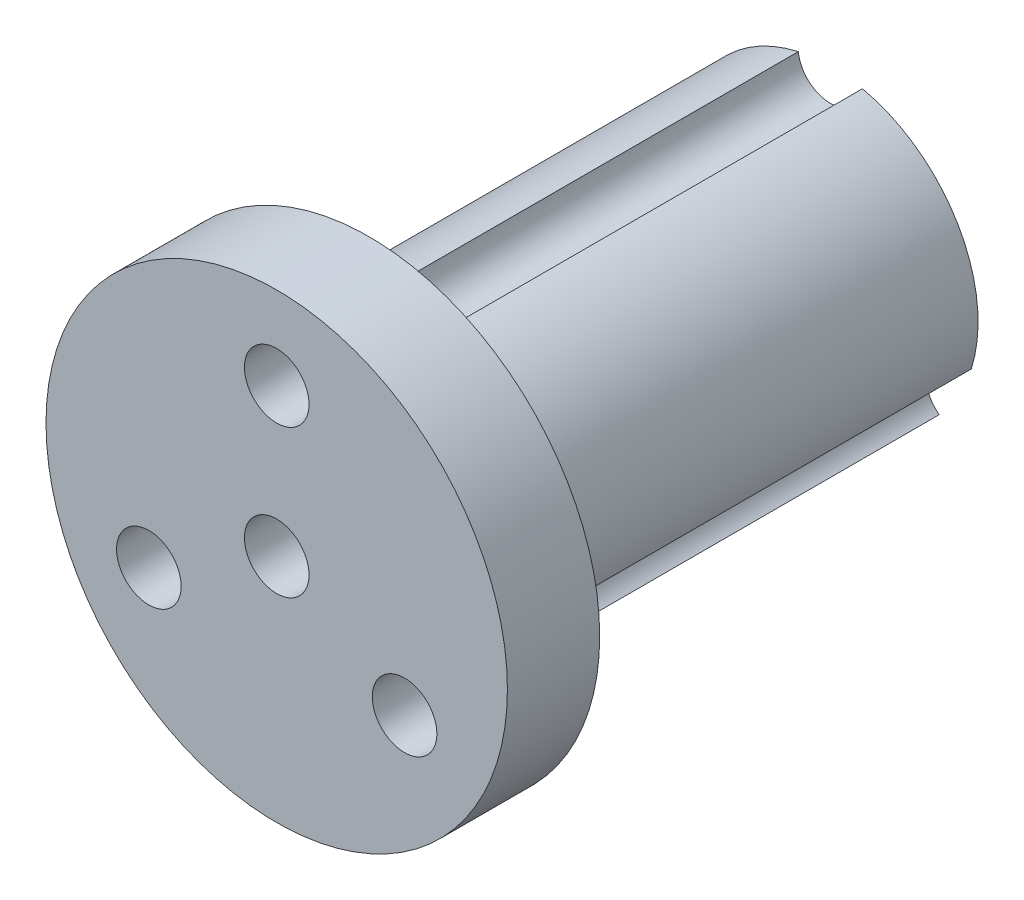
ISO-10303-21;
HEADER;
FILE_DESCRIPTION(('STEP AP214'),'2;1');
FILE_NAME('part.step','',(''),(''),'','','');
FILE_SCHEMA(('AUTOMOTIVE_DESIGN { 1 0 10303 214 1 1 1 1 }'));
ENDSEC;
DATA;
#1=APPLICATION_CONTEXT('core data for automotive mechanical design processes');
#2=APPLICATION_PROTOCOL_DEFINITION('international standard','automotive_design',2000,#1);
#3=PRODUCT_CONTEXT('',#1,'mechanical');
#4=PRODUCT('Part','Part','',(#3));
#5=PRODUCT_RELATED_PRODUCT_CATEGORY('part','',(#4));
#6=PRODUCT_DEFINITION_FORMATION('','',#4);
#7=PRODUCT_DEFINITION_CONTEXT('part definition',#1,'design');
#8=PRODUCT_DEFINITION('design','',#6,#7);
#9=PRODUCT_DEFINITION_SHAPE('','',#8);
#10=(LENGTH_UNIT() NAMED_UNIT(*) SI_UNIT(.MILLI.,.METRE.));
#11=(NAMED_UNIT(*) PLANE_ANGLE_UNIT() SI_UNIT($,.RADIAN.));
#12=(NAMED_UNIT(*) SI_UNIT($,.STERADIAN.) SOLID_ANGLE_UNIT());
#13=UNCERTAINTY_MEASURE_WITH_UNIT(LENGTH_MEASURE(1.E-05),#10,'distance_accuracy_value','');
#14=(GEOMETRIC_REPRESENTATION_CONTEXT(3) GLOBAL_UNCERTAINTY_ASSIGNED_CONTEXT((#13)) GLOBAL_UNIT_ASSIGNED_CONTEXT((#10,
#11,#12)) REPRESENTATION_CONTEXT('',''));
#15=CARTESIAN_POINT('',(0.,0.,0.));
#16=DIRECTION('',(0.,0.,1.));
#17=DIRECTION('',(1.,0.,0.));
#18=AXIS2_PLACEMENT_3D('',#15,#16,#17);
#19=CARTESIAN_POINT('',(0.,0.,25.));
#20=DIRECTION('',(0.,0.,-1.));
#21=DIRECTION('',(-1.,0.,0.));
#22=AXIS2_PLACEMENT_3D('',#19,#20,#21);
#23=CYLINDRICAL_SURFACE('',#22,8.);
#24=CARTESIAN_POINT('',(0.,0.,0.));
#25=DIRECTION('',(0.,0.,1.));
#26=DIRECTION('',(1.,0.,0.));
#27=AXIS2_PLACEMENT_3D('',#24,#25,#26);
#28=CIRCLE('',#27,8.);
#29=CARTESIAN_POINT('',(-5.89269006705129,-5.41074891061072,0.));
#30=VERTEX_POINT('',#29);
#31=CARTESIAN_POINT('',(5.89269006705122,-5.41074891061079,0.));
#32=VERTEX_POINT('',#31);
#33=EDGE_CURVE('E124',#30,#32,#28,.T.);
#34=ORIENTED_EDGE('',*,*,#33,.T.);
#35=DIRECTION('',(0.,0.,1.));
#36=VECTOR('',#35,1.);
#37=CARTESIAN_POINT('',(5.89269006705122,-5.41074891061079,11.));
#38=LINE('',#37,#36);
#39=CARTESIAN_POINT('',(5.89269006705122,-5.41074891061079,25.));
#40=VERTEX_POINT('',#39);
#41=EDGE_CURVE('E146',#32,#40,#38,.T.);
#42=ORIENTED_EDGE('',*,*,#41,.T.);
#43=CARTESIAN_POINT('',(0.,0.,25.));
#44=DIRECTION('',(0.,0.,1.));
#45=DIRECTION('',(1.,0.,0.));
#46=AXIS2_PLACEMENT_3D('',#43,#44,#45);
#47=CIRCLE('',#46,8.);
#48=CARTESIAN_POINT('',(-5.89269006705129,-5.41074891061072,25.));
#49=VERTEX_POINT('',#48);
#50=EDGE_CURVE('E118',#49,#40,#47,.T.);
#51=ORIENTED_EDGE('',*,*,#50,.F.);
#52=DIRECTION('',(0.,0.,1.));
#53=VECTOR('',#52,1.);
#54=CARTESIAN_POINT('',(-5.89269006705129,-5.41074891061072,11.));
#55=LINE('',#54,#53);
#56=EDGE_CURVE('E62',#49,#30,#55,.F.);
#57=ORIENTED_EDGE('',*,*,#56,.T.);
#58=EDGE_LOOP('',(#34,#42,#51,#57));
#59=FACE_BOUND('',#58,.T.);
#60=ADVANCED_FACE('F39',(#59),#23,.T.);
#61=CARTESIAN_POINT('',(-1.73950097656223,7.80859375,0.));
#62=VERTEX_POINT('',#61);
#63=CARTESIAN_POINT('',(-7.63219104361351,-2.39784483938926,0.));
#64=VERTEX_POINT('',#63);
#65=EDGE_CURVE('E119',#62,#64,#28,.T.);
#66=ORIENTED_EDGE('',*,*,#65,.T.);
#67=DIRECTION('',(0.,0.,1.));
#68=VECTOR('',#67,1.);
#69=CARTESIAN_POINT('',(-7.63219104361351,-2.39784483938926,11.));
#70=LINE('',#69,#68);
#71=CARTESIAN_POINT('',(-7.63219104361351,-2.39784483938926,25.));
#72=VERTEX_POINT('',#71);
#73=EDGE_CURVE('E133',#64,#72,#70,.T.);
#74=ORIENTED_EDGE('',*,*,#73,.T.);
#75=CARTESIAN_POINT('',(-1.73950097656222,7.80859375,25.));
#76=VERTEX_POINT('',#75);
#77=EDGE_CURVE('E103',#76,#72,#47,.T.);
#78=ORIENTED_EDGE('',*,*,#77,.F.);
#79=DIRECTION('',(0.,0.,1.));
#80=VECTOR('',#79,1.);
#81=CARTESIAN_POINT('',(-1.73950097656223,7.80859375,11.));
#82=LINE('',#81,#80);
#83=EDGE_CURVE('E97',#76,#62,#82,.F.);
#84=ORIENTED_EDGE('',*,*,#83,.T.);
#85=EDGE_LOOP('',(#66,#74,#78,#84));
#86=FACE_BOUND('',#85,.T.);
#87=ADVANCED_FACE('F131',(#86),#23,.T.);
#88=CARTESIAN_POINT('',(7.63219104361348,-2.39784483938936,25.));
#89=VERTEX_POINT('',#88);
#90=CARTESIAN_POINT('',(1.73950097656222,7.80859375,25.));
#91=VERTEX_POINT('',#90);
#92=EDGE_CURVE('E108',#89,#91,#47,.T.);
#93=ORIENTED_EDGE('',*,*,#92,.F.);
#94=DIRECTION('',(0.,0.,1.));
#95=VECTOR('',#94,1.);
#96=CARTESIAN_POINT('',(7.63219104361348,-2.39784483938936,11.));
#97=LINE('',#96,#95);
#98=CARTESIAN_POINT('',(7.63219104361348,-2.39784483938936,0.));
#99=VERTEX_POINT('',#98);
#100=EDGE_CURVE('E55',#89,#99,#97,.F.);
#101=ORIENTED_EDGE('',*,*,#100,.T.);
#102=CARTESIAN_POINT('',(1.73950097656223,7.80859375,0.));
#103=VERTEX_POINT('',#102);
#104=EDGE_CURVE('E110',#99,#103,#28,.T.);
#105=ORIENTED_EDGE('',*,*,#104,.T.);
#106=DIRECTION('',(0.,0.,1.));
#107=VECTOR('',#106,1.);
#108=CARTESIAN_POINT('',(1.73950097656223,7.80859375,11.));
#109=LINE('',#108,#107);
#110=EDGE_CURVE('E94',#103,#91,#109,.T.);
#111=ORIENTED_EDGE('',*,*,#110,.T.);
#112=EDGE_LOOP('',(#93,#101,#105,#111));
#113=FACE_BOUND('',#112,.T.);
#114=ADVANCED_FACE('F41',(#113),#23,.T.);
#115=CARTESIAN_POINT('',(0.,0.,0.));
#116=DIRECTION('',(0.,0.,1.));
#117=DIRECTION('',(1.,0.,0.));
#118=AXIS2_PLACEMENT_3D('',#115,#116,#117);
#119=PLANE('',#118);
#120=CARTESIAN_POINT('',(0.,0.,0.));
#121=DIRECTION('',(0.,0.,1.));
#122=DIRECTION('',(1.,0.,0.));
#123=AXIS2_PLACEMENT_3D('',#120,#121,#122);
#124=CIRCLE('',#123,1.75);
#125=CARTESIAN_POINT('',(1.75,0.,0.));
#126=VERTEX_POINT('',#125);
#127=EDGE_CURVE('E154',#126,#126,#124,.T.);
#128=ORIENTED_EDGE('',*,*,#127,.T.);
#129=EDGE_LOOP('',(#128));
#130=FACE_BOUND('',#129,.T.);
#131=ORIENTED_EDGE('',*,*,#104,.F.);
#132=CARTESIAN_POINT('',(6.92820323027546,-4.00000000000008,0.));
#133=DIRECTION('',(0.,0.,1.));
#134=DIRECTION('',(1.,0.,0.));
#135=AXIS2_PLACEMENT_3D('',#132,#133,#134);
#136=CIRCLE('',#135,1.75);
#137=EDGE_CURVE('E150',#99,#32,#136,.T.);
#138=ORIENTED_EDGE('',*,*,#137,.T.);
#139=ORIENTED_EDGE('',*,*,#33,.F.);
#140=CARTESIAN_POINT('',(-6.92820323027551,-3.99999999999999,0.));
#141=DIRECTION('',(0.,0.,1.));
#142=DIRECTION('',(1.,0.,0.));
#143=AXIS2_PLACEMENT_3D('',#140,#141,#142);
#144=CIRCLE('',#143,1.75);
#145=EDGE_CURVE('E136',#30,#64,#144,.T.);
#146=ORIENTED_EDGE('',*,*,#145,.T.);
#147=ORIENTED_EDGE('',*,*,#65,.F.);
#148=CARTESIAN_POINT('',(0.,8.,0.));
#149=DIRECTION('',(0.,0.,1.));
#150=DIRECTION('',(1.,0.,0.));
#151=AXIS2_PLACEMENT_3D('',#148,#149,#150);
#152=CIRCLE('',#151,1.75);
#153=EDGE_CURVE('E112',#62,#103,#152,.T.);
#154=ORIENTED_EDGE('',*,*,#153,.T.);
#155=EDGE_LOOP('',(#131,#138,#139,#146,#147,#154));
#156=FACE_BOUND('',#155,.T.);
#157=ADVANCED_FACE('F187',(#130,#156),#119,.F.);
#158=CARTESIAN_POINT('',(0.,0.,30.));
#159=DIRECTION('',(0.,0.,-1.));
#160=DIRECTION('',(-1.,0.,0.));
#161=AXIS2_PLACEMENT_3D('',#158,#159,#160);
#162=CYLINDRICAL_SURFACE('',#161,12.5);
#163=CARTESIAN_POINT('',(0.,0.,30.));
#164=DIRECTION('',(0.,0.,1.));
#165=DIRECTION('',(1.,0.,0.));
#166=AXIS2_PLACEMENT_3D('',#163,#164,#165);
#167=CIRCLE('',#166,12.5);
#168=CARTESIAN_POINT('',(12.5,0.,30.));
#169=VERTEX_POINT('',#168);
#170=EDGE_CURVE('E159',#169,#169,#167,.T.);
#171=ORIENTED_EDGE('',*,*,#170,.F.);
#172=EDGE_LOOP('',(#171));
#173=FACE_BOUND('',#172,.T.);
#174=CARTESIAN_POINT('',(0.,0.,25.));
#175=DIRECTION('',(0.,0.,1.));
#176=DIRECTION('',(1.,0.,0.));
#177=AXIS2_PLACEMENT_3D('',#174,#175,#176);
#178=CIRCLE('',#177,12.5);
#179=CARTESIAN_POINT('',(12.5,0.,25.));
#180=VERTEX_POINT('',#179);
#181=EDGE_CURVE('E158',#180,#180,#178,.T.);
#182=ORIENTED_EDGE('',*,*,#181,.T.);
#183=EDGE_LOOP('',(#182));
#184=FACE_BOUND('',#183,.T.);
#185=ADVANCED_FACE('F166',(#173,#184),#162,.T.);
#186=CARTESIAN_POINT('',(0.,0.,30.));
#187=DIRECTION('',(0.,0.,1.));
#188=DIRECTION('',(1.,0.,0.));
#189=AXIS2_PLACEMENT_3D('',#186,#187,#188);
#190=PLANE('',#189);
#191=CARTESIAN_POINT('',(6.92820323027546,-4.00000000000008,30.));
#192=DIRECTION('',(0.,0.,1.));
#193=DIRECTION('',(1.,0.,0.));
#194=AXIS2_PLACEMENT_3D('',#191,#192,#193);
#195=CIRCLE('',#194,1.75);
#196=CARTESIAN_POINT('',(8.67820323027546,-4.00000000000008,30.));
#197=VERTEX_POINT('',#196);
#198=EDGE_CURVE('E233',#197,#197,#195,.T.);
#199=ORIENTED_EDGE('',*,*,#198,.F.);
#200=EDGE_LOOP('',(#199));
#201=FACE_BOUND('',#200,.T.);
#202=CARTESIAN_POINT('',(-6.92820323027551,-3.99999999999999,30.));
#203=DIRECTION('',(0.,0.,1.));
#204=DIRECTION('',(1.,0.,0.));
#205=AXIS2_PLACEMENT_3D('',#202,#203,#204);
#206=CIRCLE('',#205,1.75);
#207=CARTESIAN_POINT('',(-5.17820323027552,-3.99999999999999,30.));
#208=VERTEX_POINT('',#207);
#209=EDGE_CURVE('E230',#208,#208,#206,.T.);
#210=ORIENTED_EDGE('',*,*,#209,.F.);
#211=EDGE_LOOP('',(#210));
#212=FACE_BOUND('',#211,.T.);
#213=CARTESIAN_POINT('',(0.,8.,30.));
#214=DIRECTION('',(0.,0.,1.));
#215=DIRECTION('',(1.,0.,0.));
#216=AXIS2_PLACEMENT_3D('',#213,#214,#215);
#217=CIRCLE('',#216,1.75);
#218=CARTESIAN_POINT('',(1.75,8.,30.));
#219=VERTEX_POINT('',#218);
#220=EDGE_CURVE('E224',#219,#219,#217,.T.);
#221=ORIENTED_EDGE('',*,*,#220,.F.);
#222=EDGE_LOOP('',(#221));
#223=FACE_BOUND('',#222,.T.);
#224=CARTESIAN_POINT('',(0.,0.,30.));
#225=DIRECTION('',(0.,0.,1.));
#226=DIRECTION('',(1.,0.,0.));
#227=AXIS2_PLACEMENT_3D('',#224,#225,#226);
#228=CIRCLE('',#227,1.75);
#229=CARTESIAN_POINT('',(1.75,0.,30.));
#230=VERTEX_POINT('',#229);
#231=EDGE_CURVE('E221',#230,#230,#228,.T.);
#232=ORIENTED_EDGE('',*,*,#231,.F.);
#233=EDGE_LOOP('',(#232));
#234=FACE_BOUND('',#233,.T.);
#235=ORIENTED_EDGE('',*,*,#170,.T.);
#236=EDGE_LOOP('',(#235));
#237=FACE_BOUND('',#236,.T.);
#238=ADVANCED_FACE('F168',(#201,#212,#223,#234,#237),#190,.T.);
#239=CARTESIAN_POINT('',(0.,0.,25.));
#240=DIRECTION('',(0.,0.,1.));
#241=DIRECTION('',(1.,0.,0.));
#242=AXIS2_PLACEMENT_3D('',#239,#240,#241);
#243=PLANE('',#242);
#244=ORIENTED_EDGE('',*,*,#50,.T.);
#245=CARTESIAN_POINT('',(6.92820323027546,-4.00000000000008,25.));
#246=DIRECTION('',(0.,0.,1.));
#247=DIRECTION('',(1.,0.,0.));
#248=AXIS2_PLACEMENT_3D('',#245,#246,#247);
#249=CIRCLE('',#248,1.75);
#250=EDGE_CURVE('E11',#40,#89,#249,.T.);
#251=ORIENTED_EDGE('',*,*,#250,.T.);
#252=ORIENTED_EDGE('',*,*,#92,.T.);
#253=CARTESIAN_POINT('',(0.,8.,25.));
#254=DIRECTION('',(0.,0.,1.));
#255=DIRECTION('',(1.,0.,0.));
#256=AXIS2_PLACEMENT_3D('',#253,#254,#255);
#257=CIRCLE('',#256,1.75);
#258=EDGE_CURVE('E91',#91,#76,#257,.T.);
#259=ORIENTED_EDGE('',*,*,#258,.T.);
#260=ORIENTED_EDGE('',*,*,#77,.T.);
#261=CARTESIAN_POINT('',(-6.92820323027551,-3.99999999999999,25.));
#262=DIRECTION('',(0.,0.,1.));
#263=DIRECTION('',(1.,0.,0.));
#264=AXIS2_PLACEMENT_3D('',#261,#262,#263);
#265=CIRCLE('',#264,1.75);
#266=EDGE_CURVE('E48',#72,#49,#265,.T.);
#267=ORIENTED_EDGE('',*,*,#266,.T.);
#268=EDGE_LOOP('',(#244,#251,#252,#259,#260,#267));
#269=FACE_BOUND('',#268,.T.);
#270=ORIENTED_EDGE('',*,*,#181,.F.);
#271=EDGE_LOOP('',(#270));
#272=FACE_BOUND('',#271,.T.);
#273=ADVANCED_FACE('F115',(#269,#272),#243,.F.);
#274=CARTESIAN_POINT('',(0.,8.,-8.00000000000002));
#275=DIRECTION('',(0.,0.,1.));
#276=DIRECTION('',(1.,0.,0.));
#277=AXIS2_PLACEMENT_3D('',#274,#275,#276);
#278=CYLINDRICAL_SURFACE('',#277,1.75);
#279=ORIENTED_EDGE('',*,*,#220,.T.);
#280=EDGE_LOOP('',(#279));
#281=FACE_BOUND('',#280,.T.);
#282=ORIENTED_EDGE('',*,*,#83,.F.);
#283=ORIENTED_EDGE('',*,*,#258,.F.);
#284=ORIENTED_EDGE('',*,*,#110,.F.);
#285=ORIENTED_EDGE('',*,*,#153,.F.);
#286=EDGE_LOOP('',(#282,#283,#284,#285));
#287=FACE_BOUND('',#286,.T.);
#288=ADVANCED_FACE('F93',(#281,#287),#278,.F.);
#289=CARTESIAN_POINT('',(-6.92820323027551,-3.99999999999999,-8.00000000000002));
#290=DIRECTION('',(0.,0.,1.));
#291=DIRECTION('',(1.,0.,0.));
#292=AXIS2_PLACEMENT_3D('',#289,#290,#291);
#293=CYLINDRICAL_SURFACE('',#292,1.75);
#294=ORIENTED_EDGE('',*,*,#209,.T.);
#295=EDGE_LOOP('',(#294));
#296=FACE_BOUND('',#295,.T.);
#297=ORIENTED_EDGE('',*,*,#56,.F.);
#298=ORIENTED_EDGE('',*,*,#266,.F.);
#299=ORIENTED_EDGE('',*,*,#73,.F.);
#300=ORIENTED_EDGE('',*,*,#145,.F.);
#301=EDGE_LOOP('',(#297,#298,#299,#300));
#302=FACE_BOUND('',#301,.T.);
#303=ADVANCED_FACE('F174',(#296,#302),#293,.F.);
#304=CARTESIAN_POINT('',(6.92820323027546,-4.00000000000008,-8.00000000000002));
#305=DIRECTION('',(0.,0.,1.));
#306=DIRECTION('',(1.,0.,0.));
#307=AXIS2_PLACEMENT_3D('',#304,#305,#306);
#308=CYLINDRICAL_SURFACE('',#307,1.75);
#309=ORIENTED_EDGE('',*,*,#198,.T.);
#310=EDGE_LOOP('',(#309));
#311=FACE_BOUND('',#310,.T.);
#312=ORIENTED_EDGE('',*,*,#100,.F.);
#313=ORIENTED_EDGE('',*,*,#250,.F.);
#314=ORIENTED_EDGE('',*,*,#41,.F.);
#315=ORIENTED_EDGE('',*,*,#137,.F.);
#316=EDGE_LOOP('',(#312,#313,#314,#315));
#317=FACE_BOUND('',#316,.T.);
#318=ADVANCED_FACE('F203',(#311,#317),#308,.F.);
#319=CARTESIAN_POINT('',(0.,0.,-8.00000000000002));
#320=DIRECTION('',(0.,0.,1.));
#321=DIRECTION('',(1.,0.,0.));
#322=AXIS2_PLACEMENT_3D('',#319,#320,#321);
#323=CYLINDRICAL_SURFACE('',#322,1.75);
#324=ORIENTED_EDGE('',*,*,#231,.T.);
#325=EDGE_LOOP('',(#324));
#326=FACE_BOUND('',#325,.T.);
#327=ORIENTED_EDGE('',*,*,#127,.F.);
#328=EDGE_LOOP('',(#327));
#329=FACE_BOUND('',#328,.T.);
#330=ADVANCED_FACE('F209',(#326,#329),#323,.F.);
#331=CLOSED_SHELL('',(#60,#87,#114,#157,#185,#238,#273,#288,#303,#318,#330));
#332=MANIFOLD_SOLID_BREP('B2',#331);
#333=ADVANCED_BREP_SHAPE_REPRESENTATION('',(#18,#332),#14);
#334=SHAPE_DEFINITION_REPRESENTATION(#9,#333);
ENDSEC;
END-ISO-10303-21;
